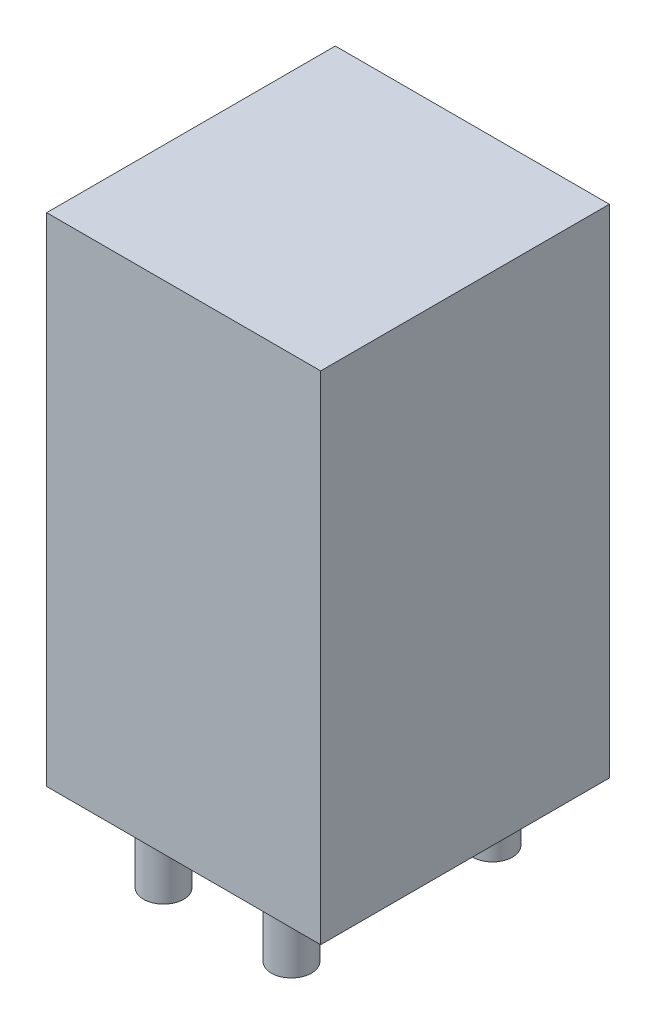
ISO-10303-21;
HEADER;
FILE_DESCRIPTION(('STEP AP214'),'2;1');
FILE_NAME('part.step','',(''),(''),'','','');
FILE_SCHEMA(('AUTOMOTIVE_DESIGN { 1 0 10303 214 1 1 1 1 }'));
ENDSEC;
DATA;
#1=APPLICATION_CONTEXT('core data for automotive mechanical design processes');
#2=APPLICATION_PROTOCOL_DEFINITION('international standard','automotive_design',2000,#1);
#3=PRODUCT_CONTEXT('',#1,'mechanical');
#4=PRODUCT('Part','Part','',(#3));
#5=PRODUCT_RELATED_PRODUCT_CATEGORY('part','',(#4));
#6=PRODUCT_DEFINITION_FORMATION('','',#4);
#7=PRODUCT_DEFINITION_CONTEXT('part definition',#1,'design');
#8=PRODUCT_DEFINITION('design','',#6,#7);
#9=PRODUCT_DEFINITION_SHAPE('','',#8);
#10=(LENGTH_UNIT() NAMED_UNIT(*) SI_UNIT(.MILLI.,.METRE.));
#11=(NAMED_UNIT(*) PLANE_ANGLE_UNIT() SI_UNIT($,.RADIAN.));
#12=(NAMED_UNIT(*) SI_UNIT($,.STERADIAN.) SOLID_ANGLE_UNIT());
#13=UNCERTAINTY_MEASURE_WITH_UNIT(LENGTH_MEASURE(1.E-05),#10,'distance_accuracy_value','');
#14=(GEOMETRIC_REPRESENTATION_CONTEXT(3) GLOBAL_UNCERTAINTY_ASSIGNED_CONTEXT((#13)) GLOBAL_UNIT_ASSIGNED_CONTEXT((#10,
#11,#12)) REPRESENTATION_CONTEXT('',''));
#15=CARTESIAN_POINT('',(0.,0.,0.));
#16=DIRECTION('',(0.,0.,1.));
#17=DIRECTION('',(1.,0.,0.));
#18=AXIS2_PLACEMENT_3D('',#15,#16,#17);
#19=CARTESIAN_POINT('',(0.,13.6,0.));
#20=DIRECTION('',(1.,0.,0.));
#21=DIRECTION('',(0.,0.,-1.));
#22=AXIS2_PLACEMENT_3D('',#19,#20,#21);
#23=PLANE('',#22);
#24=DIRECTION('',(0.,0.,1.));
#25=VECTOR('',#24,1.);
#26=CARTESIAN_POINT('',(0.,0.,0.));
#27=LINE('',#26,#25);
#28=CARTESIAN_POINT('',(0.,0.,-7.9));
#29=VERTEX_POINT('',#28);
#30=CARTESIAN_POINT('',(0.,0.,0.));
#31=VERTEX_POINT('',#30);
#32=EDGE_CURVE('E96',#29,#31,#27,.T.);
#33=ORIENTED_EDGE('',*,*,#32,.T.);
#34=DIRECTION('',(0.,-1.,0.));
#35=VECTOR('',#34,1.);
#36=CARTESIAN_POINT('',(0.,13.6,0.));
#37=LINE('',#36,#35);
#38=CARTESIAN_POINT('',(0.,13.6,0.));
#39=VERTEX_POINT('',#38);
#40=EDGE_CURVE('E11',#39,#31,#37,.T.);
#41=ORIENTED_EDGE('',*,*,#40,.F.);
#42=DIRECTION('',(0.,0.,1.));
#43=VECTOR('',#42,1.);
#44=CARTESIAN_POINT('',(0.,13.6,0.));
#45=LINE('',#44,#43);
#46=CARTESIAN_POINT('',(0.,13.6,-7.9));
#47=VERTEX_POINT('',#46);
#48=EDGE_CURVE('E84',#47,#39,#45,.T.);
#49=ORIENTED_EDGE('',*,*,#48,.F.);
#50=DIRECTION('',(0.,-1.,0.));
#51=VECTOR('',#50,1.);
#52=CARTESIAN_POINT('',(0.,13.6,-7.9));
#53=LINE('',#52,#51);
#54=EDGE_CURVE('E92',#47,#29,#53,.T.);
#55=ORIENTED_EDGE('',*,*,#54,.T.);
#56=EDGE_LOOP('',(#33,#41,#49,#55));
#57=FACE_BOUND('',#56,.T.);
#58=ADVANCED_FACE('F33',(#57),#23,.F.);
#59=CARTESIAN_POINT('',(0.,13.6,0.));
#60=DIRECTION('',(0.,0.,-1.));
#61=DIRECTION('',(-1.,0.,0.));
#62=AXIS2_PLACEMENT_3D('',#59,#60,#61);
#63=PLANE('',#62);
#64=DIRECTION('',(1.,0.,0.));
#65=VECTOR('',#64,1.);
#66=CARTESIAN_POINT('',(0.,0.,0.));
#67=LINE('',#66,#65);
#68=CARTESIAN_POINT('',(7.5,0.,0.));
#69=VERTEX_POINT('',#68);
#70=EDGE_CURVE('E88',#31,#69,#67,.T.);
#71=ORIENTED_EDGE('',*,*,#70,.T.);
#72=DIRECTION('',(0.,-1.,0.));
#73=VECTOR('',#72,1.);
#74=CARTESIAN_POINT('',(7.5,13.6,0.));
#75=LINE('',#74,#73);
#76=CARTESIAN_POINT('',(7.5,13.6,0.));
#77=VERTEX_POINT('',#76);
#78=EDGE_CURVE('E41',#77,#69,#75,.T.);
#79=ORIENTED_EDGE('',*,*,#78,.F.);
#80=DIRECTION('',(1.,0.,0.));
#81=VECTOR('',#80,1.);
#82=CARTESIAN_POINT('',(0.,13.6,0.));
#83=LINE('',#82,#81);
#84=EDGE_CURVE('E79',#39,#77,#83,.T.);
#85=ORIENTED_EDGE('',*,*,#84,.F.);
#86=ORIENTED_EDGE('',*,*,#40,.T.);
#87=EDGE_LOOP('',(#71,#79,#85,#86));
#88=FACE_BOUND('',#87,.T.);
#89=ADVANCED_FACE('F87',(#88),#63,.F.);
#90=CARTESIAN_POINT('',(7.5,13.6,0.));
#91=DIRECTION('',(-1.,0.,0.));
#92=DIRECTION('',(0.,0.,1.));
#93=AXIS2_PLACEMENT_3D('',#90,#91,#92);
#94=PLANE('',#93);
#95=DIRECTION('',(0.,0.,-1.));
#96=VECTOR('',#95,1.);
#97=CARTESIAN_POINT('',(7.5,0.,0.));
#98=LINE('',#97,#96);
#99=CARTESIAN_POINT('',(7.5,0.,-7.9));
#100=VERTEX_POINT('',#99);
#101=EDGE_CURVE('E66',#69,#100,#98,.T.);
#102=ORIENTED_EDGE('',*,*,#101,.T.);
#103=DIRECTION('',(0.,-1.,0.));
#104=VECTOR('',#103,1.);
#105=CARTESIAN_POINT('',(7.5,13.6,-7.9));
#106=LINE('',#105,#104);
#107=CARTESIAN_POINT('',(7.5,13.6,-7.9));
#108=VERTEX_POINT('',#107);
#109=EDGE_CURVE('E89',#108,#100,#106,.T.);
#110=ORIENTED_EDGE('',*,*,#109,.F.);
#111=DIRECTION('',(0.,0.,-1.));
#112=VECTOR('',#111,1.);
#113=CARTESIAN_POINT('',(7.5,13.6,0.));
#114=LINE('',#113,#112);
#115=EDGE_CURVE('E82',#77,#108,#114,.T.);
#116=ORIENTED_EDGE('',*,*,#115,.F.);
#117=ORIENTED_EDGE('',*,*,#78,.T.);
#118=EDGE_LOOP('',(#102,#110,#116,#117));
#119=FACE_BOUND('',#118,.T.);
#120=ADVANCED_FACE('F90',(#119),#94,.F.);
#121=CARTESIAN_POINT('',(0.,13.6,-7.9));
#122=DIRECTION('',(0.,0.,1.));
#123=DIRECTION('',(1.,0.,0.));
#124=AXIS2_PLACEMENT_3D('',#121,#122,#123);
#125=PLANE('',#124);
#126=DIRECTION('',(-1.,0.,0.));
#127=VECTOR('',#126,1.);
#128=CARTESIAN_POINT('',(0.,0.,-7.9));
#129=LINE('',#128,#127);
#130=EDGE_CURVE('E72',#100,#29,#129,.T.);
#131=ORIENTED_EDGE('',*,*,#130,.T.);
#132=ORIENTED_EDGE('',*,*,#54,.F.);
#133=DIRECTION('',(-1.,0.,0.));
#134=VECTOR('',#133,1.);
#135=CARTESIAN_POINT('',(0.,13.6,-7.9));
#136=LINE('',#135,#134);
#137=EDGE_CURVE('E49',#108,#47,#136,.T.);
#138=ORIENTED_EDGE('',*,*,#137,.F.);
#139=ORIENTED_EDGE('',*,*,#109,.T.);
#140=EDGE_LOOP('',(#131,#132,#138,#139));
#141=FACE_BOUND('',#140,.T.);
#142=ADVANCED_FACE('F104',(#141),#125,.F.);
#143=CARTESIAN_POINT('',(0.,13.6,0.));
#144=DIRECTION('',(0.,-1.,0.));
#145=DIRECTION('',(0.,0.,-1.));
#146=AXIS2_PLACEMENT_3D('',#143,#144,#145);
#147=PLANE('',#146);
#148=ORIENTED_EDGE('',*,*,#48,.T.);
#149=ORIENTED_EDGE('',*,*,#84,.T.);
#150=ORIENTED_EDGE('',*,*,#115,.T.);
#151=ORIENTED_EDGE('',*,*,#137,.T.);
#152=EDGE_LOOP('',(#148,#149,#150,#151));
#153=FACE_BOUND('',#152,.T.);
#154=ADVANCED_FACE('F80',(#153),#147,.F.);
#155=CARTESIAN_POINT('',(0.,0.,0.));
#156=DIRECTION('',(0.,-1.,0.));
#157=DIRECTION('',(0.,0.,-1.));
#158=AXIS2_PLACEMENT_3D('',#155,#156,#157);
#159=PLANE('',#158);
#160=CARTESIAN_POINT('',(5.5,0.,-6.7));
#161=DIRECTION('',(0.,-1.,0.));
#162=DIRECTION('',(0.,0.,-1.));
#163=AXIS2_PLACEMENT_3D('',#160,#161,#162);
#164=CIRCLE('',#163,0.55);
#165=CARTESIAN_POINT('',(5.5,0.,-7.25));
#166=VERTEX_POINT('',#165);
#167=EDGE_CURVE('E128',#166,#166,#164,.T.);
#168=ORIENTED_EDGE('',*,*,#167,.F.);
#169=EDGE_LOOP('',(#168));
#170=FACE_BOUND('',#169,.T.);
#171=CARTESIAN_POINT('',(5.5,0.,-1.2));
#172=DIRECTION('',(0.,-1.,0.));
#173=DIRECTION('',(0.,0.,-1.));
#174=AXIS2_PLACEMENT_3D('',#171,#172,#173);
#175=CIRCLE('',#174,0.55);
#176=CARTESIAN_POINT('',(5.5,0.,-1.75));
#177=VERTEX_POINT('',#176);
#178=EDGE_CURVE('E122',#177,#177,#175,.T.);
#179=ORIENTED_EDGE('',*,*,#178,.F.);
#180=EDGE_LOOP('',(#179));
#181=FACE_BOUND('',#180,.T.);
#182=CARTESIAN_POINT('',(2.,0.,-6.7));
#183=DIRECTION('',(0.,-1.,0.));
#184=DIRECTION('',(0.,0.,-1.));
#185=AXIS2_PLACEMENT_3D('',#182,#183,#184);
#186=CIRCLE('',#185,0.55);
#187=CARTESIAN_POINT('',(2.,0.,-7.25));
#188=VERTEX_POINT('',#187);
#189=EDGE_CURVE('E116',#188,#188,#186,.T.);
#190=ORIENTED_EDGE('',*,*,#189,.F.);
#191=EDGE_LOOP('',(#190));
#192=FACE_BOUND('',#191,.T.);
#193=CARTESIAN_POINT('',(2.,0.,-1.2));
#194=DIRECTION('',(0.,-1.,0.));
#195=DIRECTION('',(0.,0.,-1.));
#196=AXIS2_PLACEMENT_3D('',#193,#194,#195);
#197=CIRCLE('',#196,0.55);
#198=CARTESIAN_POINT('',(2.,0.,-1.75));
#199=VERTEX_POINT('',#198);
#200=EDGE_CURVE('E110',#199,#199,#197,.T.);
#201=ORIENTED_EDGE('',*,*,#200,.F.);
#202=EDGE_LOOP('',(#201));
#203=FACE_BOUND('',#202,.T.);
#204=ORIENTED_EDGE('',*,*,#32,.F.);
#205=ORIENTED_EDGE('',*,*,#130,.F.);
#206=ORIENTED_EDGE('',*,*,#101,.F.);
#207=ORIENTED_EDGE('',*,*,#70,.F.);
#208=EDGE_LOOP('',(#204,#205,#206,#207));
#209=FACE_BOUND('',#208,.T.);
#210=ADVANCED_FACE('F107',(#170,#181,#192,#203,#209),#159,.T.);
#211=CARTESIAN_POINT('',(2.,-2.,-1.2));
#212=DIRECTION('',(0.,1.,0.));
#213=DIRECTION('',(0.,0.,1.));
#214=AXIS2_PLACEMENT_3D('',#211,#212,#213);
#215=CYLINDRICAL_SURFACE('',#214,0.55);
#216=CARTESIAN_POINT('',(2.,-2.,-1.2));
#217=DIRECTION('',(0.,-1.,0.));
#218=DIRECTION('',(0.,0.,-1.));
#219=AXIS2_PLACEMENT_3D('',#216,#217,#218);
#220=CIRCLE('',#219,0.55);
#221=CARTESIAN_POINT('',(2.,-2.,-1.75));
#222=VERTEX_POINT('',#221);
#223=EDGE_CURVE('E99',#222,#222,#220,.T.);
#224=ORIENTED_EDGE('',*,*,#223,.F.);
#225=EDGE_LOOP('',(#224));
#226=FACE_BOUND('',#225,.T.);
#227=ORIENTED_EDGE('',*,*,#200,.T.);
#228=EDGE_LOOP('',(#227));
#229=FACE_BOUND('',#228,.T.);
#230=ADVANCED_FACE('F145',(#226,#229),#215,.T.);
#231=CARTESIAN_POINT('',(2.,-2.,-1.2));
#232=DIRECTION('',(0.,-1.,0.));
#233=DIRECTION('',(0.,0.,-1.));
#234=AXIS2_PLACEMENT_3D('',#231,#232,#233);
#235=PLANE('',#234);
#236=ORIENTED_EDGE('',*,*,#223,.T.);
#237=EDGE_LOOP('',(#236));
#238=FACE_BOUND('',#237,.T.);
#239=ADVANCED_FACE('F154',(#238),#235,.T.);
#240=CARTESIAN_POINT('',(2.,-2.,-6.7));
#241=DIRECTION('',(0.,1.,0.));
#242=DIRECTION('',(0.,0.,1.));
#243=AXIS2_PLACEMENT_3D('',#240,#241,#242);
#244=CYLINDRICAL_SURFACE('',#243,0.55);
#245=CARTESIAN_POINT('',(2.,-2.,-6.7));
#246=DIRECTION('',(0.,-1.,0.));
#247=DIRECTION('',(0.,0.,-1.));
#248=AXIS2_PLACEMENT_3D('',#245,#246,#247);
#249=CIRCLE('',#248,0.55);
#250=CARTESIAN_POINT('',(2.,-2.,-7.25));
#251=VERTEX_POINT('',#250);
#252=EDGE_CURVE('E113',#251,#251,#249,.T.);
#253=ORIENTED_EDGE('',*,*,#252,.F.);
#254=EDGE_LOOP('',(#253));
#255=FACE_BOUND('',#254,.T.);
#256=ORIENTED_EDGE('',*,*,#189,.T.);
#257=EDGE_LOOP('',(#256));
#258=FACE_BOUND('',#257,.T.);
#259=ADVANCED_FACE('F160',(#255,#258),#244,.T.);
#260=CARTESIAN_POINT('',(2.,-2.,-6.7));
#261=DIRECTION('',(0.,-1.,0.));
#262=DIRECTION('',(0.,0.,-1.));
#263=AXIS2_PLACEMENT_3D('',#260,#261,#262);
#264=PLANE('',#263);
#265=ORIENTED_EDGE('',*,*,#252,.T.);
#266=EDGE_LOOP('',(#265));
#267=FACE_BOUND('',#266,.T.);
#268=ADVANCED_FACE('F203',(#267),#264,.T.);
#269=CARTESIAN_POINT('',(5.5,-2.,-1.2));
#270=DIRECTION('',(0.,1.,0.));
#271=DIRECTION('',(0.,0.,1.));
#272=AXIS2_PLACEMENT_3D('',#269,#270,#271);
#273=CYLINDRICAL_SURFACE('',#272,0.55);
#274=CARTESIAN_POINT('',(5.5,-2.,-1.2));
#275=DIRECTION('',(0.,-1.,0.));
#276=DIRECTION('',(0.,0.,-1.));
#277=AXIS2_PLACEMENT_3D('',#274,#275,#276);
#278=CIRCLE('',#277,0.55);
#279=CARTESIAN_POINT('',(5.5,-2.,-1.75));
#280=VERTEX_POINT('',#279);
#281=EDGE_CURVE('E119',#280,#280,#278,.T.);
#282=ORIENTED_EDGE('',*,*,#281,.F.);
#283=EDGE_LOOP('',(#282));
#284=FACE_BOUND('',#283,.T.);
#285=ORIENTED_EDGE('',*,*,#178,.T.);
#286=EDGE_LOOP('',(#285));
#287=FACE_BOUND('',#286,.T.);
#288=ADVANCED_FACE('F213',(#284,#287),#273,.T.);
#289=CARTESIAN_POINT('',(5.5,-2.,-1.2));
#290=DIRECTION('',(0.,-1.,0.));
#291=DIRECTION('',(0.,0.,-1.));
#292=AXIS2_PLACEMENT_3D('',#289,#290,#291);
#293=PLANE('',#292);
#294=ORIENTED_EDGE('',*,*,#281,.T.);
#295=EDGE_LOOP('',(#294));
#296=FACE_BOUND('',#295,.T.);
#297=ADVANCED_FACE('F139',(#296),#293,.T.);
#298=CARTESIAN_POINT('',(5.5,-2.,-6.7));
#299=DIRECTION('',(0.,1.,0.));
#300=DIRECTION('',(0.,0.,1.));
#301=AXIS2_PLACEMENT_3D('',#298,#299,#300);
#302=CYLINDRICAL_SURFACE('',#301,0.55);
#303=CARTESIAN_POINT('',(5.5,-2.,-6.7));
#304=DIRECTION('',(0.,-1.,0.));
#305=DIRECTION('',(0.,0.,-1.));
#306=AXIS2_PLACEMENT_3D('',#303,#304,#305);
#307=CIRCLE('',#306,0.55);
#308=CARTESIAN_POINT('',(5.5,-2.,-7.25));
#309=VERTEX_POINT('',#308);
#310=EDGE_CURVE('E125',#309,#309,#307,.T.);
#311=ORIENTED_EDGE('',*,*,#310,.F.);
#312=EDGE_LOOP('',(#311));
#313=FACE_BOUND('',#312,.T.);
#314=ORIENTED_EDGE('',*,*,#167,.T.);
#315=EDGE_LOOP('',(#314));
#316=FACE_BOUND('',#315,.T.);
#317=ADVANCED_FACE('F136',(#313,#316),#302,.T.);
#318=CARTESIAN_POINT('',(5.5,-2.,-6.7));
#319=DIRECTION('',(0.,-1.,0.));
#320=DIRECTION('',(0.,0.,-1.));
#321=AXIS2_PLACEMENT_3D('',#318,#319,#320);
#322=PLANE('',#321);
#323=ORIENTED_EDGE('',*,*,#310,.T.);
#324=EDGE_LOOP('',(#323));
#325=FACE_BOUND('',#324,.T.);
#326=ADVANCED_FACE('F134',(#325),#322,.T.);
#327=CLOSED_SHELL('',(#58,#89,#120,#142,#154,#210,#230,#239,#259,#268,#288,#297,#317,#326));
#328=MANIFOLD_SOLID_BREP('B2',#327);
#329=ADVANCED_BREP_SHAPE_REPRESENTATION('',(#18,#328),#14);
#330=SHAPE_DEFINITION_REPRESENTATION(#9,#329);
ENDSEC;
END-ISO-10303-21;
